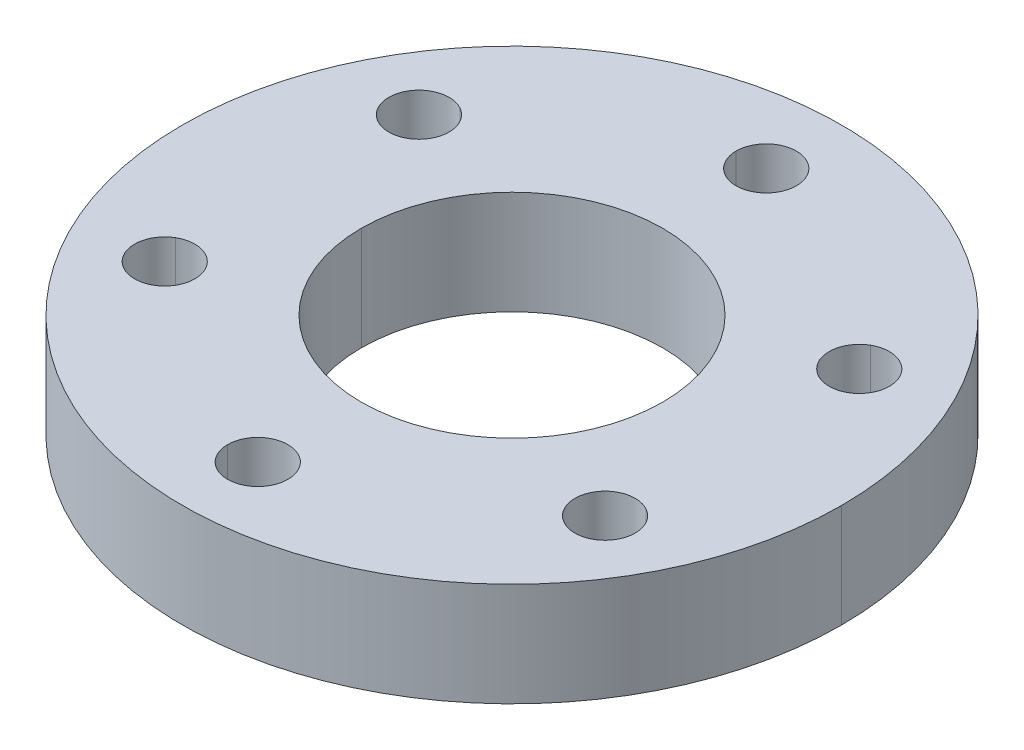
ISO-10303-21;
HEADER;
FILE_DESCRIPTION(('STEP AP214'),'2;1');
FILE_NAME('part.step','',(''),(''),'','','');
FILE_SCHEMA(('AUTOMOTIVE_DESIGN { 1 0 10303 214 1 1 1 1 }'));
ENDSEC;
DATA;
#1=APPLICATION_CONTEXT('core data for automotive mechanical design processes');
#2=APPLICATION_PROTOCOL_DEFINITION('international standard','automotive_design',2000,#1);
#3=PRODUCT_CONTEXT('',#1,'mechanical');
#4=PRODUCT('Part','Part','',(#3));
#5=PRODUCT_RELATED_PRODUCT_CATEGORY('part','',(#4));
#6=PRODUCT_DEFINITION_FORMATION('','',#4);
#7=PRODUCT_DEFINITION_CONTEXT('part definition',#1,'design');
#8=PRODUCT_DEFINITION('design','',#6,#7);
#9=PRODUCT_DEFINITION_SHAPE('','',#8);
#10=(LENGTH_UNIT() NAMED_UNIT(*) SI_UNIT(.MILLI.,.METRE.));
#11=(NAMED_UNIT(*) PLANE_ANGLE_UNIT() SI_UNIT($,.RADIAN.));
#12=(NAMED_UNIT(*) SI_UNIT($,.STERADIAN.) SOLID_ANGLE_UNIT());
#13=UNCERTAINTY_MEASURE_WITH_UNIT(LENGTH_MEASURE(1.E-05),#10,'distance_accuracy_value','');
#14=(GEOMETRIC_REPRESENTATION_CONTEXT(3) GLOBAL_UNCERTAINTY_ASSIGNED_CONTEXT((#13)) GLOBAL_UNIT_ASSIGNED_CONTEXT((#10,
#11,#12)) REPRESENTATION_CONTEXT('',''));
#15=CARTESIAN_POINT('',(0.,0.,0.));
#16=DIRECTION('',(0.,0.,1.));
#17=DIRECTION('',(1.,0.,0.));
#18=AXIS2_PLACEMENT_3D('',#15,#16,#17);
#19=CARTESIAN_POINT('',(-11.6913429510899,2.75,6.75));
#20=DIRECTION('',(0.,1.,0.));
#21=DIRECTION('',(-0.5,0.,-0.866025403784439));
#22=AXIS2_PLACEMENT_3D('',#19,#20,#21);
#23=CYLINDRICAL_SURFACE('',#22,1.6);
#24=CARTESIAN_POINT('',(-11.6913429510899,-2.75,6.75));
#25=DIRECTION('',(0.,1.,0.));
#26=DIRECTION('',(0.5,0.,0.866025403784439));
#27=AXIS2_PLACEMENT_3D('',#24,#25,#26);
#28=CIRCLE('',#27,1.6);
#29=CARTESIAN_POINT('',(-10.8913429510899,-2.75,8.1356406460551));
#30=VERTEX_POINT('',#29);
#31=CARTESIAN_POINT('',(-12.4913429510899,-2.75,5.3643593539449));
#32=VERTEX_POINT('',#31);
#33=EDGE_CURVE('E31',#30,#32,#28,.T.);
#34=ORIENTED_EDGE('',*,*,#33,.F.);
#35=DIRECTION('',(0.,-1.,0.));
#36=VECTOR('',#35,1.);
#37=CARTESIAN_POINT('',(-10.8913429510899,2.75,8.1356406460551));
#38=LINE('',#37,#36);
#39=CARTESIAN_POINT('',(-10.8913429510899,2.75,8.1356406460551));
#40=VERTEX_POINT('',#39);
#41=EDGE_CURVE('E11',#40,#30,#38,.T.);
#42=ORIENTED_EDGE('',*,*,#41,.F.);
#43=CARTESIAN_POINT('',(-11.6913429510899,2.75,6.75));
#44=DIRECTION('',(0.,1.,0.));
#45=DIRECTION('',(0.5,0.,0.866025403784439));
#46=AXIS2_PLACEMENT_3D('',#43,#44,#45);
#47=CIRCLE('',#46,1.6);
#48=CARTESIAN_POINT('',(-12.4913429510899,2.75,5.3643593539449));
#49=VERTEX_POINT('',#48);
#50=EDGE_CURVE('E221',#40,#49,#47,.T.);
#51=ORIENTED_EDGE('',*,*,#50,.T.);
#52=DIRECTION('',(0.,-1.,0.));
#53=VECTOR('',#52,1.);
#54=CARTESIAN_POINT('',(-12.4913429510899,2.75,5.3643593539449));
#55=LINE('',#54,#53);
#56=EDGE_CURVE('E24',#49,#32,#55,.T.);
#57=ORIENTED_EDGE('',*,*,#56,.T.);
#58=EDGE_LOOP('',(#34,#42,#51,#57));
#59=FACE_BOUND('',#58,.T.);
#60=ADVANCED_FACE('F17',(#59),#23,.F.);
#61=CARTESIAN_POINT('',(-11.6913429510899,2.75,6.75));
#62=DIRECTION('',(0.,1.,0.));
#63=DIRECTION('',(-0.5,0.,-0.866025403784439));
#64=AXIS2_PLACEMENT_3D('',#61,#62,#63);
#65=CYLINDRICAL_SURFACE('',#64,1.6);
#66=CARTESIAN_POINT('',(-11.6913429510899,2.75,6.75));
#67=DIRECTION('',(0.,1.,0.));
#68=DIRECTION('',(-0.499999999999999,0.,-0.866025403784439));
#69=AXIS2_PLACEMENT_3D('',#66,#67,#68);
#70=CIRCLE('',#69,1.6);
#71=EDGE_CURVE('E219',#49,#40,#70,.T.);
#72=ORIENTED_EDGE('',*,*,#71,.T.);
#73=ORIENTED_EDGE('',*,*,#41,.T.);
#74=CARTESIAN_POINT('',(-11.6913429510899,-2.75,6.75));
#75=DIRECTION('',(0.,1.,0.));
#76=DIRECTION('',(-0.500000000000001,0.,-0.866025403784438));
#77=AXIS2_PLACEMENT_3D('',#74,#75,#76);
#78=CIRCLE('',#77,1.6);
#79=EDGE_CURVE('E180',#32,#30,#78,.T.);
#80=ORIENTED_EDGE('',*,*,#79,.F.);
#81=ORIENTED_EDGE('',*,*,#56,.F.);
#82=EDGE_LOOP('',(#72,#73,#80,#81));
#83=FACE_BOUND('',#82,.T.);
#84=ADVANCED_FACE('F257',(#83),#65,.F.);
#85=CARTESIAN_POINT('',(-11.6913429510899,2.75,-6.75));
#86=DIRECTION('',(0.,1.,0.));
#87=DIRECTION('',(0.5,0.,-0.866025403784438));
#88=AXIS2_PLACEMENT_3D('',#85,#86,#87);
#89=CYLINDRICAL_SURFACE('',#88,1.6);
#90=CARTESIAN_POINT('',(-11.6913429510899,-2.75,-6.75));
#91=DIRECTION('',(0.,1.,0.));
#92=DIRECTION('',(-0.500000000000001,0.,0.866025403784438));
#93=AXIS2_PLACEMENT_3D('',#90,#91,#92);
#94=CIRCLE('',#93,1.6);
#95=CARTESIAN_POINT('',(-12.4913429510899,-2.75,-5.3643593539449));
#96=VERTEX_POINT('',#95);
#97=CARTESIAN_POINT('',(-10.8913429510899,-2.75,-8.1356406460551));
#98=VERTEX_POINT('',#97);
#99=EDGE_CURVE('E177',#96,#98,#94,.T.);
#100=ORIENTED_EDGE('',*,*,#99,.F.);
#101=DIRECTION('',(0.,-1.,0.));
#102=VECTOR('',#101,1.);
#103=CARTESIAN_POINT('',(-12.4913429510899,2.75,-5.3643593539449));
#104=LINE('',#103,#102);
#105=CARTESIAN_POINT('',(-12.4913429510899,2.75,-5.3643593539449));
#106=VERTEX_POINT('',#105);
#107=EDGE_CURVE('E250',#106,#96,#104,.T.);
#108=ORIENTED_EDGE('',*,*,#107,.F.);
#109=CARTESIAN_POINT('',(-11.6913429510899,2.75,-6.75));
#110=DIRECTION('',(0.,1.,0.));
#111=DIRECTION('',(-0.500000000000001,0.,0.866025403784438));
#112=AXIS2_PLACEMENT_3D('',#109,#110,#111);
#113=CIRCLE('',#112,1.6);
#114=CARTESIAN_POINT('',(-10.8913429510899,2.75,-8.1356406460551));
#115=VERTEX_POINT('',#114);
#116=EDGE_CURVE('E217',#106,#115,#113,.T.);
#117=ORIENTED_EDGE('',*,*,#116,.T.);
#118=DIRECTION('',(0.,-1.,0.));
#119=VECTOR('',#118,1.);
#120=CARTESIAN_POINT('',(-10.8913429510899,2.75,-8.1356406460551));
#121=LINE('',#120,#119);
#122=EDGE_CURVE('E248',#115,#98,#121,.T.);
#123=ORIENTED_EDGE('',*,*,#122,.T.);
#124=EDGE_LOOP('',(#100,#108,#117,#123));
#125=FACE_BOUND('',#124,.T.);
#126=ADVANCED_FACE('F293',(#125),#89,.F.);
#127=CARTESIAN_POINT('',(-11.6913429510899,2.75,-6.75));
#128=DIRECTION('',(0.,1.,0.));
#129=DIRECTION('',(0.5,0.,-0.866025403784438));
#130=AXIS2_PLACEMENT_3D('',#127,#128,#129);
#131=CYLINDRICAL_SURFACE('',#130,1.6);
#132=CARTESIAN_POINT('',(-11.6913429510899,2.75,-6.75));
#133=DIRECTION('',(0.,1.,0.));
#134=DIRECTION('',(0.5,0.,-0.866025403784439));
#135=AXIS2_PLACEMENT_3D('',#132,#133,#134);
#136=CIRCLE('',#135,1.6);
#137=EDGE_CURVE('E214',#115,#106,#136,.T.);
#138=ORIENTED_EDGE('',*,*,#137,.T.);
#139=ORIENTED_EDGE('',*,*,#107,.T.);
#140=CARTESIAN_POINT('',(-11.6913429510899,-2.75,-6.75));
#141=DIRECTION('',(0.,1.,0.));
#142=DIRECTION('',(0.5,0.,-0.866025403784439));
#143=AXIS2_PLACEMENT_3D('',#140,#141,#142);
#144=CIRCLE('',#143,1.6);
#145=EDGE_CURVE('E174',#98,#96,#144,.T.);
#146=ORIENTED_EDGE('',*,*,#145,.F.);
#147=ORIENTED_EDGE('',*,*,#122,.F.);
#148=EDGE_LOOP('',(#138,#139,#146,#147));
#149=FACE_BOUND('',#148,.T.);
#150=ADVANCED_FACE('F297',(#149),#131,.F.);
#151=CARTESIAN_POINT('',(0.,2.75,-13.5));
#152=DIRECTION('',(0.,1.,0.));
#153=DIRECTION('',(1.,0.,0.));
#154=AXIS2_PLACEMENT_3D('',#151,#152,#153);
#155=CYLINDRICAL_SURFACE('',#154,1.6);
#156=CARTESIAN_POINT('',(0.,-2.75,-13.5));
#157=DIRECTION('',(0.,1.,0.));
#158=DIRECTION('',(-1.,0.,0.));
#159=AXIS2_PLACEMENT_3D('',#156,#157,#158);
#160=CIRCLE('',#159,1.6);
#161=CARTESIAN_POINT('',(-1.6,-2.75,-13.5));
#162=VERTEX_POINT('',#161);
#163=CARTESIAN_POINT('',(1.6,-2.75,-13.5));
#164=VERTEX_POINT('',#163);
#165=EDGE_CURVE('E171',#162,#164,#160,.T.);
#166=ORIENTED_EDGE('',*,*,#165,.F.);
#167=DIRECTION('',(0.,-1.,0.));
#168=VECTOR('',#167,1.);
#169=CARTESIAN_POINT('',(-1.6,2.75,-13.5));
#170=LINE('',#169,#168);
#171=CARTESIAN_POINT('',(-1.6,2.75,-13.5));
#172=VERTEX_POINT('',#171);
#173=EDGE_CURVE('E245',#172,#162,#170,.T.);
#174=ORIENTED_EDGE('',*,*,#173,.F.);
#175=CARTESIAN_POINT('',(0.,2.75,-13.5));
#176=DIRECTION('',(0.,1.,0.));
#177=DIRECTION('',(-1.,0.,0.));
#178=AXIS2_PLACEMENT_3D('',#175,#176,#177);
#179=CIRCLE('',#178,1.6);
#180=CARTESIAN_POINT('',(1.6,2.75,-13.5));
#181=VERTEX_POINT('',#180);
#182=EDGE_CURVE('E212',#172,#181,#179,.T.);
#183=ORIENTED_EDGE('',*,*,#182,.T.);
#184=DIRECTION('',(0.,-1.,0.));
#185=VECTOR('',#184,1.);
#186=CARTESIAN_POINT('',(1.6,2.75,-13.5));
#187=LINE('',#186,#185);
#188=EDGE_CURVE('E243',#181,#164,#187,.T.);
#189=ORIENTED_EDGE('',*,*,#188,.T.);
#190=EDGE_LOOP('',(#166,#174,#183,#189));
#191=FACE_BOUND('',#190,.T.);
#192=ADVANCED_FACE('F303',(#191),#155,.F.);
#193=CARTESIAN_POINT('',(0.,2.75,-13.5));
#194=DIRECTION('',(0.,1.,0.));
#195=DIRECTION('',(1.,0.,0.));
#196=AXIS2_PLACEMENT_3D('',#193,#194,#195);
#197=CYLINDRICAL_SURFACE('',#196,1.6);
#198=CARTESIAN_POINT('',(0.,2.75,-13.5));
#199=DIRECTION('',(0.,1.,0.));
#200=DIRECTION('',(1.,0.,0.));
#201=AXIS2_PLACEMENT_3D('',#198,#199,#200);
#202=CIRCLE('',#201,1.6);
#203=EDGE_CURVE('E209',#181,#172,#202,.T.);
#204=ORIENTED_EDGE('',*,*,#203,.T.);
#205=ORIENTED_EDGE('',*,*,#173,.T.);
#206=CARTESIAN_POINT('',(0.,-2.75,-13.5));
#207=DIRECTION('',(0.,1.,0.));
#208=DIRECTION('',(1.,0.,0.));
#209=AXIS2_PLACEMENT_3D('',#206,#207,#208);
#210=CIRCLE('',#209,1.6);
#211=EDGE_CURVE('E168',#164,#162,#210,.T.);
#212=ORIENTED_EDGE('',*,*,#211,.F.);
#213=ORIENTED_EDGE('',*,*,#188,.F.);
#214=EDGE_LOOP('',(#204,#205,#212,#213));
#215=FACE_BOUND('',#214,.T.);
#216=ADVANCED_FACE('F307',(#215),#197,.F.);
#217=CARTESIAN_POINT('',(11.6913429510899,2.75,-6.75));
#218=DIRECTION('',(0.,1.,0.));
#219=DIRECTION('',(0.5,0.,0.866025403784439));
#220=AXIS2_PLACEMENT_3D('',#217,#218,#219);
#221=CYLINDRICAL_SURFACE('',#220,1.6);
#222=CARTESIAN_POINT('',(11.6913429510899,-2.75,-6.75));
#223=DIRECTION('',(0.,1.,0.));
#224=DIRECTION('',(-0.5,0.,-0.866025403784438));
#225=AXIS2_PLACEMENT_3D('',#222,#223,#224);
#226=CIRCLE('',#225,1.6);
#227=CARTESIAN_POINT('',(10.8913429510899,-2.75,-8.1356406460551));
#228=VERTEX_POINT('',#227);
#229=CARTESIAN_POINT('',(12.4913429510899,-2.75,-5.3643593539449));
#230=VERTEX_POINT('',#229);
#231=EDGE_CURVE('E165',#228,#230,#226,.T.);
#232=ORIENTED_EDGE('',*,*,#231,.F.);
#233=DIRECTION('',(0.,-1.,0.));
#234=VECTOR('',#233,1.);
#235=CARTESIAN_POINT('',(10.8913429510899,2.75,-8.1356406460551));
#236=LINE('',#235,#234);
#237=CARTESIAN_POINT('',(10.8913429510899,2.75,-8.1356406460551));
#238=VERTEX_POINT('',#237);
#239=EDGE_CURVE('E240',#238,#228,#236,.T.);
#240=ORIENTED_EDGE('',*,*,#239,.F.);
#241=CARTESIAN_POINT('',(11.6913429510899,2.75,-6.75));
#242=DIRECTION('',(0.,1.,0.));
#243=DIRECTION('',(-0.5,0.,-0.866025403784438));
#244=AXIS2_PLACEMENT_3D('',#241,#242,#243);
#245=CIRCLE('',#244,1.6);
#246=CARTESIAN_POINT('',(12.4913429510899,2.75,-5.3643593539449));
#247=VERTEX_POINT('',#246);
#248=EDGE_CURVE('E207',#238,#247,#245,.T.);
#249=ORIENTED_EDGE('',*,*,#248,.T.);
#250=DIRECTION('',(0.,-1.,0.));
#251=VECTOR('',#250,1.);
#252=CARTESIAN_POINT('',(12.4913429510899,2.75,-5.3643593539449));
#253=LINE('',#252,#251);
#254=EDGE_CURVE('E238',#247,#230,#253,.T.);
#255=ORIENTED_EDGE('',*,*,#254,.T.);
#256=EDGE_LOOP('',(#232,#240,#249,#255));
#257=FACE_BOUND('',#256,.T.);
#258=ADVANCED_FACE('F311',(#257),#221,.F.);
#259=CARTESIAN_POINT('',(11.6913429510899,2.75,-6.75));
#260=DIRECTION('',(0.,1.,0.));
#261=DIRECTION('',(0.5,0.,0.866025403784439));
#262=AXIS2_PLACEMENT_3D('',#259,#260,#261);
#263=CYLINDRICAL_SURFACE('',#262,1.6);
#264=CARTESIAN_POINT('',(11.6913429510899,2.75,-6.75));
#265=DIRECTION('',(0.,1.,0.));
#266=DIRECTION('',(0.499999999999998,0.,0.86602540378444));
#267=AXIS2_PLACEMENT_3D('',#264,#265,#266);
#268=CIRCLE('',#267,1.6);
#269=EDGE_CURVE('E204',#247,#238,#268,.T.);
#270=ORIENTED_EDGE('',*,*,#269,.T.);
#271=ORIENTED_EDGE('',*,*,#239,.T.);
#272=CARTESIAN_POINT('',(11.6913429510899,-2.75,-6.75));
#273=DIRECTION('',(0.,1.,0.));
#274=DIRECTION('',(0.499999999999998,0.,0.86602540378444));
#275=AXIS2_PLACEMENT_3D('',#272,#273,#274);
#276=CIRCLE('',#275,1.6);
#277=EDGE_CURVE('E162',#230,#228,#276,.T.);
#278=ORIENTED_EDGE('',*,*,#277,.F.);
#279=ORIENTED_EDGE('',*,*,#254,.F.);
#280=EDGE_LOOP('',(#270,#271,#278,#279));
#281=FACE_BOUND('',#280,.T.);
#282=ADVANCED_FACE('F315',(#281),#263,.F.);
#283=CARTESIAN_POINT('',(11.6913429510899,2.75,6.75));
#284=DIRECTION('',(0.,1.,0.));
#285=DIRECTION('',(-0.5,0.,0.866025403784439));
#286=AXIS2_PLACEMENT_3D('',#283,#284,#285);
#287=CYLINDRICAL_SURFACE('',#286,1.6);
#288=CARTESIAN_POINT('',(11.6913429510899,-2.75,6.75));
#289=DIRECTION('',(0.,1.,0.));
#290=DIRECTION('',(0.5,0.,-0.866025403784439));
#291=AXIS2_PLACEMENT_3D('',#288,#289,#290);
#292=CIRCLE('',#291,1.6);
#293=CARTESIAN_POINT('',(12.4913429510899,-2.75,5.3643593539449));
#294=VERTEX_POINT('',#293);
#295=CARTESIAN_POINT('',(10.8913429510899,-2.75,8.1356406460551));
#296=VERTEX_POINT('',#295);
#297=EDGE_CURVE('E159',#294,#296,#292,.T.);
#298=ORIENTED_EDGE('',*,*,#297,.F.);
#299=DIRECTION('',(0.,-1.,0.));
#300=VECTOR('',#299,1.);
#301=CARTESIAN_POINT('',(12.4913429510899,2.75,5.3643593539449));
#302=LINE('',#301,#300);
#303=CARTESIAN_POINT('',(12.4913429510899,2.75,5.3643593539449));
#304=VERTEX_POINT('',#303);
#305=EDGE_CURVE('E235',#304,#294,#302,.T.);
#306=ORIENTED_EDGE('',*,*,#305,.F.);
#307=CARTESIAN_POINT('',(11.6913429510899,2.75,6.75));
#308=DIRECTION('',(0.,1.,0.));
#309=DIRECTION('',(0.500000000000001,0.,-0.866025403784438));
#310=AXIS2_PLACEMENT_3D('',#307,#308,#309);
#311=CIRCLE('',#310,1.6);
#312=CARTESIAN_POINT('',(10.8913429510899,2.75,8.1356406460551));
#313=VERTEX_POINT('',#312);
#314=EDGE_CURVE('E202',#304,#313,#311,.T.);
#315=ORIENTED_EDGE('',*,*,#314,.T.);
#316=DIRECTION('',(0.,-1.,0.));
#317=VECTOR('',#316,1.);
#318=CARTESIAN_POINT('',(10.8913429510899,2.75,8.1356406460551));
#319=LINE('',#318,#317);
#320=EDGE_CURVE('E233',#313,#296,#319,.T.);
#321=ORIENTED_EDGE('',*,*,#320,.T.);
#322=EDGE_LOOP('',(#298,#306,#315,#321));
#323=FACE_BOUND('',#322,.T.);
#324=ADVANCED_FACE('F319',(#323),#287,.F.);
#325=CARTESIAN_POINT('',(11.6913429510899,2.75,6.75));
#326=DIRECTION('',(0.,1.,0.));
#327=DIRECTION('',(-0.5,0.,0.866025403784439));
#328=AXIS2_PLACEMENT_3D('',#325,#326,#327);
#329=CYLINDRICAL_SURFACE('',#328,1.6);
#330=CARTESIAN_POINT('',(11.6913429510899,2.75,6.75));
#331=DIRECTION('',(0.,1.,0.));
#332=DIRECTION('',(-0.5,0.,0.866025403784439));
#333=AXIS2_PLACEMENT_3D('',#330,#331,#332);
#334=CIRCLE('',#333,1.6);
#335=EDGE_CURVE('E199',#313,#304,#334,.T.);
#336=ORIENTED_EDGE('',*,*,#335,.T.);
#337=ORIENTED_EDGE('',*,*,#305,.T.);
#338=CARTESIAN_POINT('',(11.6913429510899,-2.75,6.75));
#339=DIRECTION('',(0.,1.,0.));
#340=DIRECTION('',(-0.499999999999997,0.,0.86602540378444));
#341=AXIS2_PLACEMENT_3D('',#338,#339,#340);
#342=CIRCLE('',#341,1.6);
#343=EDGE_CURVE('E156',#296,#294,#342,.T.);
#344=ORIENTED_EDGE('',*,*,#343,.F.);
#345=ORIENTED_EDGE('',*,*,#320,.F.);
#346=EDGE_LOOP('',(#336,#337,#344,#345));
#347=FACE_BOUND('',#346,.T.);
#348=ADVANCED_FACE('F323',(#347),#329,.F.);
#349=CARTESIAN_POINT('',(0.,2.75,13.5));
#350=DIRECTION('',(0.,1.,0.));
#351=DIRECTION('',(-1.,0.,0.));
#352=AXIS2_PLACEMENT_3D('',#349,#350,#351);
#353=CYLINDRICAL_SURFACE('',#352,1.6);
#354=CARTESIAN_POINT('',(0.,-2.75,13.5));
#355=DIRECTION('',(0.,1.,0.));
#356=DIRECTION('',(1.,0.,0.));
#357=AXIS2_PLACEMENT_3D('',#354,#355,#356);
#358=CIRCLE('',#357,1.6);
#359=CARTESIAN_POINT('',(1.6,-2.75,13.5));
#360=VERTEX_POINT('',#359);
#361=CARTESIAN_POINT('',(-1.6,-2.75,13.5));
#362=VERTEX_POINT('',#361);
#363=EDGE_CURVE('E153',#360,#362,#358,.T.);
#364=ORIENTED_EDGE('',*,*,#363,.F.);
#365=DIRECTION('',(0.,-1.,0.));
#366=VECTOR('',#365,1.);
#367=CARTESIAN_POINT('',(1.6,2.75,13.5));
#368=LINE('',#367,#366);
#369=CARTESIAN_POINT('',(1.6,2.75,13.5));
#370=VERTEX_POINT('',#369);
#371=EDGE_CURVE('E230',#370,#360,#368,.T.);
#372=ORIENTED_EDGE('',*,*,#371,.F.);
#373=CARTESIAN_POINT('',(0.,2.75,13.5));
#374=DIRECTION('',(0.,1.,0.));
#375=DIRECTION('',(1.,0.,0.));
#376=AXIS2_PLACEMENT_3D('',#373,#374,#375);
#377=CIRCLE('',#376,1.6);
#378=CARTESIAN_POINT('',(-1.6,2.75,13.5));
#379=VERTEX_POINT('',#378);
#380=EDGE_CURVE('E197',#370,#379,#377,.T.);
#381=ORIENTED_EDGE('',*,*,#380,.T.);
#382=DIRECTION('',(0.,-1.,0.));
#383=VECTOR('',#382,1.);
#384=CARTESIAN_POINT('',(-1.6,2.75,13.5));
#385=LINE('',#384,#383);
#386=EDGE_CURVE('E228',#379,#362,#385,.T.);
#387=ORIENTED_EDGE('',*,*,#386,.T.);
#388=EDGE_LOOP('',(#364,#372,#381,#387));
#389=FACE_BOUND('',#388,.T.);
#390=ADVANCED_FACE('F327',(#389),#353,.F.);
#391=CARTESIAN_POINT('',(0.,2.75,13.5));
#392=DIRECTION('',(0.,1.,0.));
#393=DIRECTION('',(-1.,0.,0.));
#394=AXIS2_PLACEMENT_3D('',#391,#392,#393);
#395=CYLINDRICAL_SURFACE('',#394,1.6);
#396=CARTESIAN_POINT('',(0.,2.75,13.5));
#397=DIRECTION('',(0.,1.,0.));
#398=DIRECTION('',(-1.,0.,0.));
#399=AXIS2_PLACEMENT_3D('',#396,#397,#398);
#400=CIRCLE('',#399,1.6);
#401=EDGE_CURVE('E194',#379,#370,#400,.T.);
#402=ORIENTED_EDGE('',*,*,#401,.T.);
#403=ORIENTED_EDGE('',*,*,#371,.T.);
#404=CARTESIAN_POINT('',(0.,-2.75,13.5));
#405=DIRECTION('',(0.,1.,0.));
#406=DIRECTION('',(-1.,0.,0.));
#407=AXIS2_PLACEMENT_3D('',#404,#405,#406);
#408=CIRCLE('',#407,1.6);
#409=EDGE_CURVE('E150',#362,#360,#408,.T.);
#410=ORIENTED_EDGE('',*,*,#409,.F.);
#411=ORIENTED_EDGE('',*,*,#386,.F.);
#412=EDGE_LOOP('',(#402,#403,#410,#411));
#413=FACE_BOUND('',#412,.T.);
#414=ADVANCED_FACE('F331',(#413),#395,.F.);
#415=CARTESIAN_POINT('',(0.,-2.75,0.));
#416=DIRECTION('',(0.,1.,0.));
#417=DIRECTION('',(-1.,0.,0.));
#418=AXIS2_PLACEMENT_3D('',#415,#416,#417);
#419=CYLINDRICAL_SURFACE('',#418,8.);
#420=DIRECTION('',(0.,1.,0.));
#421=VECTOR('',#420,1.);
#422=CARTESIAN_POINT('',(-8.,-2.75,0.));
#423=LINE('',#422,#421);
#424=CARTESIAN_POINT('',(-8.,-2.75,0.));
#425=VERTEX_POINT('',#424);
#426=CARTESIAN_POINT('',(-8.,2.75,0.));
#427=VERTEX_POINT('',#426);
#428=EDGE_CURVE('E223',#425,#427,#423,.T.);
#429=ORIENTED_EDGE('',*,*,#428,.T.);
#430=CARTESIAN_POINT('',(0.,2.75,0.));
#431=DIRECTION('',(0.,-1.,0.));
#432=DIRECTION('',(1.,0.,0.));
#433=AXIS2_PLACEMENT_3D('',#430,#431,#432);
#434=CIRCLE('',#433,8.);
#435=CARTESIAN_POINT('',(8.,2.75,0.));
#436=VERTEX_POINT('',#435);
#437=EDGE_CURVE('E191',#436,#427,#434,.T.);
#438=ORIENTED_EDGE('',*,*,#437,.F.);
#439=DIRECTION('',(0.,1.,0.));
#440=VECTOR('',#439,1.);
#441=CARTESIAN_POINT('',(8.,-2.75,0.));
#442=LINE('',#441,#440);
#443=CARTESIAN_POINT('',(8.,-2.75,0.));
#444=VERTEX_POINT('',#443);
#445=EDGE_CURVE('E225',#444,#436,#442,.T.);
#446=ORIENTED_EDGE('',*,*,#445,.F.);
#447=CARTESIAN_POINT('',(0.,-2.75,0.));
#448=DIRECTION('',(0.,-1.,0.));
#449=DIRECTION('',(1.,0.,0.));
#450=AXIS2_PLACEMENT_3D('',#447,#448,#449);
#451=CIRCLE('',#450,8.);
#452=EDGE_CURVE('E148',#444,#425,#451,.T.);
#453=ORIENTED_EDGE('',*,*,#452,.T.);
#454=EDGE_LOOP('',(#429,#438,#446,#453));
#455=FACE_BOUND('',#454,.T.);
#456=ADVANCED_FACE('F271',(#455),#419,.F.);
#457=CARTESIAN_POINT('',(0.,-2.75,0.));
#458=DIRECTION('',(0.,1.,0.));
#459=DIRECTION('',(-1.,0.,0.));
#460=AXIS2_PLACEMENT_3D('',#457,#458,#459);
#461=CYLINDRICAL_SURFACE('',#460,8.);
#462=ORIENTED_EDGE('',*,*,#445,.T.);
#463=CARTESIAN_POINT('',(0.,2.75,0.));
#464=DIRECTION('',(0.,-1.,0.));
#465=DIRECTION('',(-1.,0.,0.));
#466=AXIS2_PLACEMENT_3D('',#463,#464,#465);
#467=CIRCLE('',#466,8.);
#468=EDGE_CURVE('E188',#427,#436,#467,.T.);
#469=ORIENTED_EDGE('',*,*,#468,.F.);
#470=ORIENTED_EDGE('',*,*,#428,.F.);
#471=CARTESIAN_POINT('',(0.,-2.75,0.));
#472=DIRECTION('',(0.,-1.,0.));
#473=DIRECTION('',(-1.,0.,0.));
#474=AXIS2_PLACEMENT_3D('',#471,#472,#473);
#475=CIRCLE('',#474,8.);
#476=EDGE_CURVE('E136',#425,#444,#475,.T.);
#477=ORIENTED_EDGE('',*,*,#476,.T.);
#478=EDGE_LOOP('',(#462,#469,#470,#477));
#479=FACE_BOUND('',#478,.T.);
#480=ADVANCED_FACE('F274',(#479),#461,.F.);
#481=CARTESIAN_POINT('',(0.,2.75,0.));
#482=DIRECTION('',(0.,1.,0.));
#483=DIRECTION('',(-1.,0.,0.));
#484=AXIS2_PLACEMENT_3D('',#481,#482,#483);
#485=PLANE('',#484);
#486=ORIENTED_EDGE('',*,*,#50,.F.);
#487=ORIENTED_EDGE('',*,*,#71,.F.);
#488=EDGE_LOOP('',(#486,#487));
#489=FACE_BOUND('',#488,.T.);
#490=ORIENTED_EDGE('',*,*,#116,.F.);
#491=ORIENTED_EDGE('',*,*,#137,.F.);
#492=EDGE_LOOP('',(#490,#491));
#493=FACE_BOUND('',#492,.T.);
#494=ORIENTED_EDGE('',*,*,#182,.F.);
#495=ORIENTED_EDGE('',*,*,#203,.F.);
#496=EDGE_LOOP('',(#494,#495));
#497=FACE_BOUND('',#496,.T.);
#498=ORIENTED_EDGE('',*,*,#248,.F.);
#499=ORIENTED_EDGE('',*,*,#269,.F.);
#500=EDGE_LOOP('',(#498,#499));
#501=FACE_BOUND('',#500,.T.);
#502=ORIENTED_EDGE('',*,*,#314,.F.);
#503=ORIENTED_EDGE('',*,*,#335,.F.);
#504=EDGE_LOOP('',(#502,#503));
#505=FACE_BOUND('',#504,.T.);
#506=ORIENTED_EDGE('',*,*,#380,.F.);
#507=ORIENTED_EDGE('',*,*,#401,.F.);
#508=EDGE_LOOP('',(#506,#507));
#509=FACE_BOUND('',#508,.T.);
#510=ORIENTED_EDGE('',*,*,#437,.T.);
#511=ORIENTED_EDGE('',*,*,#468,.T.);
#512=EDGE_LOOP('',(#510,#511));
#513=FACE_BOUND('',#512,.T.);
#514=CARTESIAN_POINT('',(0.,2.75,0.));
#515=DIRECTION('',(0.,1.,0.));
#516=DIRECTION('',(1.,0.,0.));
#517=AXIS2_PLACEMENT_3D('',#514,#515,#516);
#518=CIRCLE('',#517,17.5);
#519=CARTESIAN_POINT('',(17.5,2.75,0.));
#520=VERTEX_POINT('',#519);
#521=CARTESIAN_POINT('',(-17.5,2.75,0.));
#522=VERTEX_POINT('',#521);
#523=EDGE_CURVE('E185',#520,#522,#518,.T.);
#524=ORIENTED_EDGE('',*,*,#523,.T.);
#525=CARTESIAN_POINT('',(0.,2.75,0.));
#526=DIRECTION('',(0.,1.,0.));
#527=DIRECTION('',(-1.,0.,0.));
#528=AXIS2_PLACEMENT_3D('',#525,#526,#527);
#529=CIRCLE('',#528,17.5);
#530=EDGE_CURVE('E141',#522,#520,#529,.T.);
#531=ORIENTED_EDGE('',*,*,#530,.T.);
#532=EDGE_LOOP('',(#524,#531));
#533=FACE_BOUND('',#532,.T.);
#534=ADVANCED_FACE('F276',(#489,#493,#497,#501,#505,#509,#513,#533),#485,.T.);
#535=CARTESIAN_POINT('',(0.,-2.75,0.));
#536=DIRECTION('',(0.,1.,0.));
#537=DIRECTION('',(-1.,0.,0.));
#538=AXIS2_PLACEMENT_3D('',#535,#536,#537);
#539=CYLINDRICAL_SURFACE('',#538,17.5);
#540=DIRECTION('',(0.,1.,0.));
#541=VECTOR('',#540,1.);
#542=CARTESIAN_POINT('',(-17.5,-2.75,0.));
#543=LINE('',#542,#541);
#544=CARTESIAN_POINT('',(-17.5,-2.75,0.));
#545=VERTEX_POINT('',#544);
#546=EDGE_CURVE('E129',#545,#522,#543,.T.);
#547=ORIENTED_EDGE('',*,*,#546,.T.);
#548=ORIENTED_EDGE('',*,*,#523,.F.);
#549=DIRECTION('',(0.,1.,0.));
#550=VECTOR('',#549,1.);
#551=CARTESIAN_POINT('',(17.5,-2.75,0.));
#552=LINE('',#551,#550);
#553=CARTESIAN_POINT('',(17.5,-2.75,0.));
#554=VERTEX_POINT('',#553);
#555=EDGE_CURVE('E132',#554,#520,#552,.T.);
#556=ORIENTED_EDGE('',*,*,#555,.F.);
#557=CARTESIAN_POINT('',(0.,-2.75,0.));
#558=DIRECTION('',(0.,1.,0.));
#559=DIRECTION('',(1.,0.,0.));
#560=AXIS2_PLACEMENT_3D('',#557,#558,#559);
#561=CIRCLE('',#560,17.5);
#562=EDGE_CURVE('E125',#554,#545,#561,.T.);
#563=ORIENTED_EDGE('',*,*,#562,.T.);
#564=EDGE_LOOP('',(#547,#548,#556,#563));
#565=FACE_BOUND('',#564,.T.);
#566=ADVANCED_FACE('F127',(#565),#539,.T.);
#567=CARTESIAN_POINT('',(0.,-2.75,0.));
#568=DIRECTION('',(0.,1.,0.));
#569=DIRECTION('',(-1.,0.,0.));
#570=AXIS2_PLACEMENT_3D('',#567,#568,#569);
#571=CYLINDRICAL_SURFACE('',#570,17.5);
#572=ORIENTED_EDGE('',*,*,#555,.T.);
#573=ORIENTED_EDGE('',*,*,#530,.F.);
#574=ORIENTED_EDGE('',*,*,#546,.F.);
#575=CARTESIAN_POINT('',(0.,-2.75,0.));
#576=DIRECTION('',(0.,1.,0.));
#577=DIRECTION('',(-1.,0.,0.));
#578=AXIS2_PLACEMENT_3D('',#575,#576,#577);
#579=CIRCLE('',#578,17.5);
#580=EDGE_CURVE('E137',#545,#554,#579,.T.);
#581=ORIENTED_EDGE('',*,*,#580,.T.);
#582=EDGE_LOOP('',(#572,#573,#574,#581));
#583=FACE_BOUND('',#582,.T.);
#584=ADVANCED_FACE('F140',(#583),#571,.T.);
#585=CARTESIAN_POINT('',(0.,-2.75,0.));
#586=DIRECTION('',(0.,1.,0.));
#587=DIRECTION('',(-1.,0.,0.));
#588=AXIS2_PLACEMENT_3D('',#585,#586,#587);
#589=PLANE('',#588);
#590=ORIENTED_EDGE('',*,*,#33,.T.);
#591=ORIENTED_EDGE('',*,*,#79,.T.);
#592=EDGE_LOOP('',(#590,#591));
#593=FACE_BOUND('',#592,.T.);
#594=ORIENTED_EDGE('',*,*,#99,.T.);
#595=ORIENTED_EDGE('',*,*,#145,.T.);
#596=EDGE_LOOP('',(#594,#595));
#597=FACE_BOUND('',#596,.T.);
#598=ORIENTED_EDGE('',*,*,#165,.T.);
#599=ORIENTED_EDGE('',*,*,#211,.T.);
#600=EDGE_LOOP('',(#598,#599));
#601=FACE_BOUND('',#600,.T.);
#602=ORIENTED_EDGE('',*,*,#231,.T.);
#603=ORIENTED_EDGE('',*,*,#277,.T.);
#604=EDGE_LOOP('',(#602,#603));
#605=FACE_BOUND('',#604,.T.);
#606=ORIENTED_EDGE('',*,*,#297,.T.);
#607=ORIENTED_EDGE('',*,*,#343,.T.);
#608=EDGE_LOOP('',(#606,#607));
#609=FACE_BOUND('',#608,.T.);
#610=ORIENTED_EDGE('',*,*,#363,.T.);
#611=ORIENTED_EDGE('',*,*,#409,.T.);
#612=EDGE_LOOP('',(#610,#611));
#613=FACE_BOUND('',#612,.T.);
#614=ORIENTED_EDGE('',*,*,#452,.F.);
#615=ORIENTED_EDGE('',*,*,#476,.F.);
#616=EDGE_LOOP('',(#614,#615));
#617=FACE_BOUND('',#616,.T.);
#618=ORIENTED_EDGE('',*,*,#562,.F.);
#619=ORIENTED_EDGE('',*,*,#580,.F.);
#620=EDGE_LOOP('',(#618,#619));
#621=FACE_BOUND('',#620,.T.);
#622=ADVANCED_FACE('F143',(#593,#597,#601,#605,#609,#613,#617,#621),#589,.F.);
#623=CLOSED_SHELL('',(#60,#84,#126,#150,#192,#216,#258,#282,#324,#348,#390,#414,#456,#480,#534,
#566,#584,#622));
#624=MANIFOLD_SOLID_BREP('B1',#623);
#625=ADVANCED_BREP_SHAPE_REPRESENTATION('',(#18,#624),#14);
#626=SHAPE_DEFINITION_REPRESENTATION(#9,#625);
ENDSEC;
END-ISO-10303-21;
